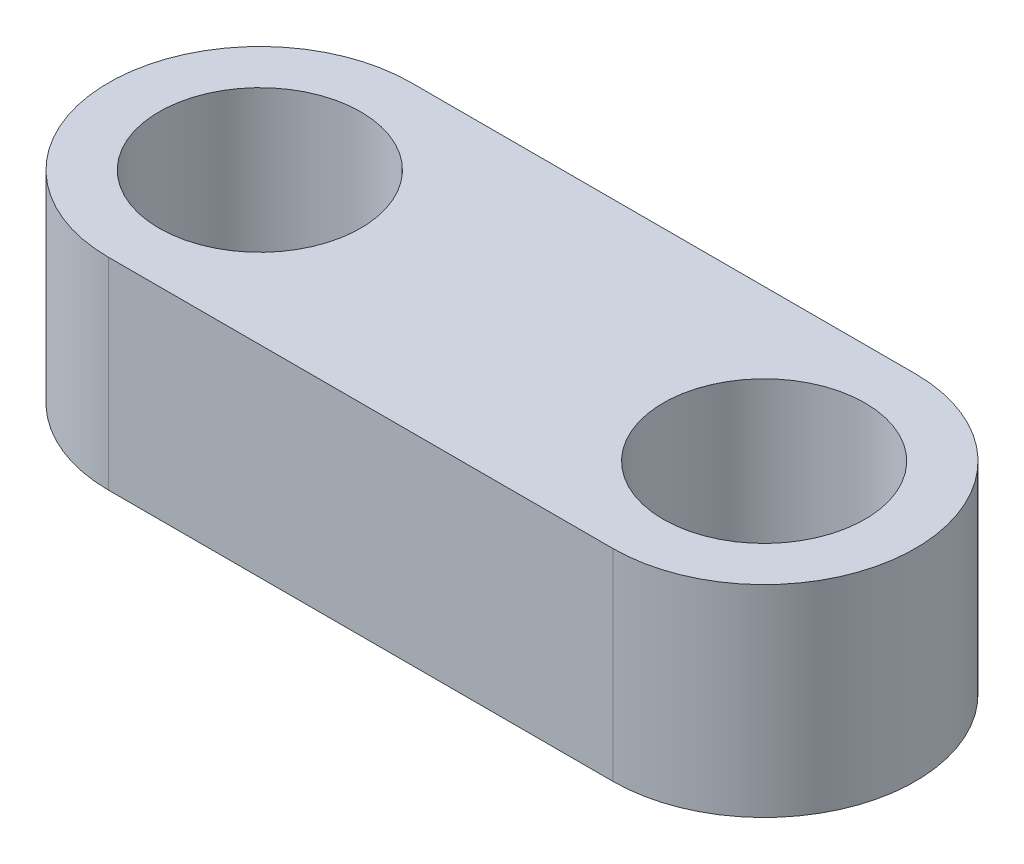
ISO-10303-21;
HEADER;
FILE_DESCRIPTION(('STEP AP214'),'2;1');
FILE_NAME('part.step','',(''),(''),'','','');
FILE_SCHEMA(('AUTOMOTIVE_DESIGN { 1 0 10303 214 1 1 1 1 }'));
ENDSEC;
DATA;
#1=APPLICATION_CONTEXT('core data for automotive mechanical design processes');
#2=APPLICATION_PROTOCOL_DEFINITION('international standard','automotive_design',2000,#1);
#3=PRODUCT_CONTEXT('',#1,'mechanical');
#4=PRODUCT('Part','Part','',(#3));
#5=PRODUCT_RELATED_PRODUCT_CATEGORY('part','',(#4));
#6=PRODUCT_DEFINITION_FORMATION('','',#4);
#7=PRODUCT_DEFINITION_CONTEXT('part definition',#1,'design');
#8=PRODUCT_DEFINITION('design','',#6,#7);
#9=PRODUCT_DEFINITION_SHAPE('','',#8);
#10=(LENGTH_UNIT() NAMED_UNIT(*) SI_UNIT(.MILLI.,.METRE.));
#11=(NAMED_UNIT(*) PLANE_ANGLE_UNIT() SI_UNIT($,.RADIAN.));
#12=(NAMED_UNIT(*) SI_UNIT($,.STERADIAN.) SOLID_ANGLE_UNIT());
#13=UNCERTAINTY_MEASURE_WITH_UNIT(LENGTH_MEASURE(1.E-05),#10,'distance_accuracy_value','');
#14=(GEOMETRIC_REPRESENTATION_CONTEXT(3) GLOBAL_UNCERTAINTY_ASSIGNED_CONTEXT((#13)) GLOBAL_UNIT_ASSIGNED_CONTEXT((#10,
#11,#12)) REPRESENTATION_CONTEXT('',''));
#15=CARTESIAN_POINT('',(0.,0.,0.));
#16=DIRECTION('',(0.,0.,1.));
#17=DIRECTION('',(1.,0.,0.));
#18=AXIS2_PLACEMENT_3D('',#15,#16,#17);
#19=CARTESIAN_POINT('',(0.,10.,-7.5));
#20=DIRECTION('',(0.,1.,0.));
#21=DIRECTION('',(0.,0.,1.));
#22=AXIS2_PLACEMENT_3D('',#19,#20,#21);
#23=PLANE('',#22);
#24=CARTESIAN_POINT('',(0.,10.,-7.5));
#25=DIRECTION('',(0.,1.,0.));
#26=DIRECTION('',(0.,0.,1.));
#27=AXIS2_PLACEMENT_3D('',#24,#25,#26);
#28=CIRCLE('',#27,5.);
#29=CARTESIAN_POINT('',(0.,10.,-2.5));
#30=VERTEX_POINT('',#29);
#31=EDGE_CURVE('E100',#30,#30,#28,.T.);
#32=ORIENTED_EDGE('',*,*,#31,.F.);
#33=EDGE_LOOP('',(#32));
#34=FACE_BOUND('',#33,.T.);
#35=CARTESIAN_POINT('',(0.,10.,-7.5));
#36=DIRECTION('',(0.,1.,0.));
#37=DIRECTION('',(0.,0.,1.));
#38=AXIS2_PLACEMENT_3D('',#35,#36,#37);
#39=CIRCLE('',#38,7.5);
#40=CARTESIAN_POINT('',(0.,10.,-15.));
#41=VERTEX_POINT('',#40);
#42=CARTESIAN_POINT('',(0.,10.,0.));
#43=VERTEX_POINT('',#42);
#44=EDGE_CURVE('E85',#41,#43,#39,.T.);
#45=ORIENTED_EDGE('',*,*,#44,.T.);
#46=DIRECTION('',(1.,0.,0.));
#47=VECTOR('',#46,1.);
#48=CARTESIAN_POINT('',(0.,10.,0.));
#49=LINE('',#48,#47);
#50=CARTESIAN_POINT('',(25.,10.,0.));
#51=VERTEX_POINT('',#50);
#52=EDGE_CURVE('E80',#43,#51,#49,.T.);
#53=ORIENTED_EDGE('',*,*,#52,.T.);
#54=CARTESIAN_POINT('',(25.,10.,-7.5));
#55=DIRECTION('',(0.,1.,0.));
#56=DIRECTION('',(0.,0.,1.));
#57=AXIS2_PLACEMENT_3D('',#54,#55,#56);
#58=CIRCLE('',#57,7.5);
#59=CARTESIAN_POINT('',(25.,10.,-15.));
#60=VERTEX_POINT('',#59);
#61=EDGE_CURVE('E83',#51,#60,#58,.T.);
#62=ORIENTED_EDGE('',*,*,#61,.T.);
#63=DIRECTION('',(-1.,0.,0.));
#64=VECTOR('',#63,1.);
#65=CARTESIAN_POINT('',(0.,10.,-15.));
#66=LINE('',#65,#64);
#67=EDGE_CURVE('E50',#60,#41,#66,.T.);
#68=ORIENTED_EDGE('',*,*,#67,.T.);
#69=EDGE_LOOP('',(#45,#53,#62,#68));
#70=FACE_BOUND('',#69,.T.);
#71=CARTESIAN_POINT('',(25.,10.,-7.5));
#72=DIRECTION('',(0.,1.,0.));
#73=DIRECTION('',(0.,0.,1.));
#74=AXIS2_PLACEMENT_3D('',#71,#72,#73);
#75=CIRCLE('',#74,5.);
#76=CARTESIAN_POINT('',(25.,10.,-2.5));
#77=VERTEX_POINT('',#76);
#78=EDGE_CURVE('E115',#77,#77,#75,.T.);
#79=ORIENTED_EDGE('',*,*,#78,.F.);
#80=EDGE_LOOP('',(#79));
#81=FACE_BOUND('',#80,.T.);
#82=ADVANCED_FACE('F33',(#34,#70,#81),#23,.T.);
#83=CARTESIAN_POINT('',(0.,0.,-7.5));
#84=DIRECTION('',(0.,1.,0.));
#85=DIRECTION('',(0.,0.,1.));
#86=AXIS2_PLACEMENT_3D('',#83,#84,#85);
#87=PLANE('',#86);
#88=CARTESIAN_POINT('',(0.,0.,-7.5));
#89=DIRECTION('',(0.,1.,0.));
#90=DIRECTION('',(0.,0.,1.));
#91=AXIS2_PLACEMENT_3D('',#88,#89,#90);
#92=CIRCLE('',#91,7.5);
#93=CARTESIAN_POINT('',(0.,0.,-15.));
#94=VERTEX_POINT('',#93);
#95=CARTESIAN_POINT('',(0.,0.,0.));
#96=VERTEX_POINT('',#95);
#97=EDGE_CURVE('E97',#94,#96,#92,.T.);
#98=ORIENTED_EDGE('',*,*,#97,.F.);
#99=DIRECTION('',(-1.,0.,0.));
#100=VECTOR('',#99,1.);
#101=CARTESIAN_POINT('',(0.,0.,-15.));
#102=LINE('',#101,#100);
#103=CARTESIAN_POINT('',(25.,0.,-15.));
#104=VERTEX_POINT('',#103);
#105=EDGE_CURVE('E73',#104,#94,#102,.T.);
#106=ORIENTED_EDGE('',*,*,#105,.F.);
#107=CARTESIAN_POINT('',(25.,0.,-7.5));
#108=DIRECTION('',(0.,1.,0.));
#109=DIRECTION('',(0.,0.,1.));
#110=AXIS2_PLACEMENT_3D('',#107,#108,#109);
#111=CIRCLE('',#110,7.5);
#112=CARTESIAN_POINT('',(25.,0.,0.));
#113=VERTEX_POINT('',#112);
#114=EDGE_CURVE('E67',#113,#104,#111,.T.);
#115=ORIENTED_EDGE('',*,*,#114,.F.);
#116=DIRECTION('',(1.,0.,0.));
#117=VECTOR('',#116,1.);
#118=CARTESIAN_POINT('',(0.,0.,0.));
#119=LINE('',#118,#117);
#120=EDGE_CURVE('E89',#96,#113,#119,.T.);
#121=ORIENTED_EDGE('',*,*,#120,.F.);
#122=EDGE_LOOP('',(#98,#106,#115,#121));
#123=FACE_BOUND('',#122,.T.);
#124=CARTESIAN_POINT('',(0.,0.,-7.5));
#125=DIRECTION('',(0.,1.,0.));
#126=DIRECTION('',(0.,0.,1.));
#127=AXIS2_PLACEMENT_3D('',#124,#125,#126);
#128=CIRCLE('',#127,5.);
#129=CARTESIAN_POINT('',(0.,0.,-2.5));
#130=VERTEX_POINT('',#129);
#131=EDGE_CURVE('E112',#130,#130,#128,.T.);
#132=ORIENTED_EDGE('',*,*,#131,.T.);
#133=EDGE_LOOP('',(#132));
#134=FACE_BOUND('',#133,.T.);
#135=CARTESIAN_POINT('',(25.,0.,-7.5));
#136=DIRECTION('',(0.,1.,0.));
#137=DIRECTION('',(0.,0.,1.));
#138=AXIS2_PLACEMENT_3D('',#135,#136,#137);
#139=CIRCLE('',#138,5.);
#140=CARTESIAN_POINT('',(25.,0.,-2.5));
#141=VERTEX_POINT('',#140);
#142=EDGE_CURVE('E118',#141,#141,#139,.T.);
#143=ORIENTED_EDGE('',*,*,#142,.T.);
#144=EDGE_LOOP('',(#143));
#145=FACE_BOUND('',#144,.T.);
#146=ADVANCED_FACE('F108',(#123,#134,#145),#87,.F.);
#147=CARTESIAN_POINT('',(0.,10.,-7.5));
#148=DIRECTION('',(0.,-1.,0.));
#149=DIRECTION('',(0.,0.,-1.));
#150=AXIS2_PLACEMENT_3D('',#147,#148,#149);
#151=CYLINDRICAL_SURFACE('',#150,7.5);
#152=ORIENTED_EDGE('',*,*,#97,.T.);
#153=DIRECTION('',(0.,-1.,0.));
#154=VECTOR('',#153,1.);
#155=CARTESIAN_POINT('',(0.,10.,0.));
#156=LINE('',#155,#154);
#157=EDGE_CURVE('E11',#43,#96,#156,.T.);
#158=ORIENTED_EDGE('',*,*,#157,.F.);
#159=ORIENTED_EDGE('',*,*,#44,.F.);
#160=DIRECTION('',(0.,-1.,0.));
#161=VECTOR('',#160,1.);
#162=CARTESIAN_POINT('',(0.,10.,-15.));
#163=LINE('',#162,#161);
#164=EDGE_CURVE('E93',#41,#94,#163,.T.);
#165=ORIENTED_EDGE('',*,*,#164,.T.);
#166=EDGE_LOOP('',(#152,#158,#159,#165));
#167=FACE_BOUND('',#166,.T.);
#168=ADVANCED_FACE('F35',(#167),#151,.T.);
#169=CARTESIAN_POINT('',(0.,10.,0.));
#170=DIRECTION('',(0.,0.,-1.));
#171=DIRECTION('',(-1.,0.,0.));
#172=AXIS2_PLACEMENT_3D('',#169,#170,#171);
#173=PLANE('',#172);
#174=ORIENTED_EDGE('',*,*,#120,.T.);
#175=DIRECTION('',(0.,-1.,0.));
#176=VECTOR('',#175,1.);
#177=CARTESIAN_POINT('',(25.,10.,0.));
#178=LINE('',#177,#176);
#179=EDGE_CURVE('E42',#51,#113,#178,.T.);
#180=ORIENTED_EDGE('',*,*,#179,.F.);
#181=ORIENTED_EDGE('',*,*,#52,.F.);
#182=ORIENTED_EDGE('',*,*,#157,.T.);
#183=EDGE_LOOP('',(#174,#180,#181,#182));
#184=FACE_BOUND('',#183,.T.);
#185=ADVANCED_FACE('F88',(#184),#173,.F.);
#186=CARTESIAN_POINT('',(25.,10.,-7.5));
#187=DIRECTION('',(0.,-1.,0.));
#188=DIRECTION('',(0.,0.,-1.));
#189=AXIS2_PLACEMENT_3D('',#186,#187,#188);
#190=CYLINDRICAL_SURFACE('',#189,7.5);
#191=ORIENTED_EDGE('',*,*,#114,.T.);
#192=DIRECTION('',(0.,-1.,0.));
#193=VECTOR('',#192,1.);
#194=CARTESIAN_POINT('',(25.,10.,-15.));
#195=LINE('',#194,#193);
#196=EDGE_CURVE('E90',#60,#104,#195,.T.);
#197=ORIENTED_EDGE('',*,*,#196,.F.);
#198=ORIENTED_EDGE('',*,*,#61,.F.);
#199=ORIENTED_EDGE('',*,*,#179,.T.);
#200=EDGE_LOOP('',(#191,#197,#198,#199));
#201=FACE_BOUND('',#200,.T.);
#202=ADVANCED_FACE('F91',(#201),#190,.T.);
#203=CARTESIAN_POINT('',(0.,10.,-15.));
#204=DIRECTION('',(0.,0.,1.));
#205=DIRECTION('',(1.,0.,0.));
#206=AXIS2_PLACEMENT_3D('',#203,#204,#205);
#207=PLANE('',#206);
#208=ORIENTED_EDGE('',*,*,#105,.T.);
#209=ORIENTED_EDGE('',*,*,#164,.F.);
#210=ORIENTED_EDGE('',*,*,#67,.F.);
#211=ORIENTED_EDGE('',*,*,#196,.T.);
#212=EDGE_LOOP('',(#208,#209,#210,#211));
#213=FACE_BOUND('',#212,.T.);
#214=ADVANCED_FACE('F105',(#213),#207,.F.);
#215=CARTESIAN_POINT('',(0.,10.,-7.5));
#216=DIRECTION('',(0.,-1.,0.));
#217=DIRECTION('',(0.,0.,-1.));
#218=AXIS2_PLACEMENT_3D('',#215,#216,#217);
#219=CYLINDRICAL_SURFACE('',#218,5.);
#220=ORIENTED_EDGE('',*,*,#31,.T.);
#221=EDGE_LOOP('',(#220));
#222=FACE_BOUND('',#221,.T.);
#223=ORIENTED_EDGE('',*,*,#131,.F.);
#224=EDGE_LOOP('',(#223));
#225=FACE_BOUND('',#224,.T.);
#226=ADVANCED_FACE('F135',(#222,#225),#219,.F.);
#227=CARTESIAN_POINT('',(25.,10.,-7.5));
#228=DIRECTION('',(0.,-1.,0.));
#229=DIRECTION('',(0.,0.,-1.));
#230=AXIS2_PLACEMENT_3D('',#227,#228,#229);
#231=CYLINDRICAL_SURFACE('',#230,5.);
#232=ORIENTED_EDGE('',*,*,#78,.T.);
#233=EDGE_LOOP('',(#232));
#234=FACE_BOUND('',#233,.T.);
#235=ORIENTED_EDGE('',*,*,#142,.F.);
#236=EDGE_LOOP('',(#235));
#237=FACE_BOUND('',#236,.T.);
#238=ADVANCED_FACE('F124',(#234,#237),#231,.F.);
#239=CLOSED_SHELL('',(#82,#146,#168,#185,#202,#214,#226,#238));
#240=MANIFOLD_SOLID_BREP('B2',#239);
#241=ADVANCED_BREP_SHAPE_REPRESENTATION('',(#18,#240),#14);
#242=SHAPE_DEFINITION_REPRESENTATION(#9,#241);
ENDSEC;
END-ISO-10303-21;
